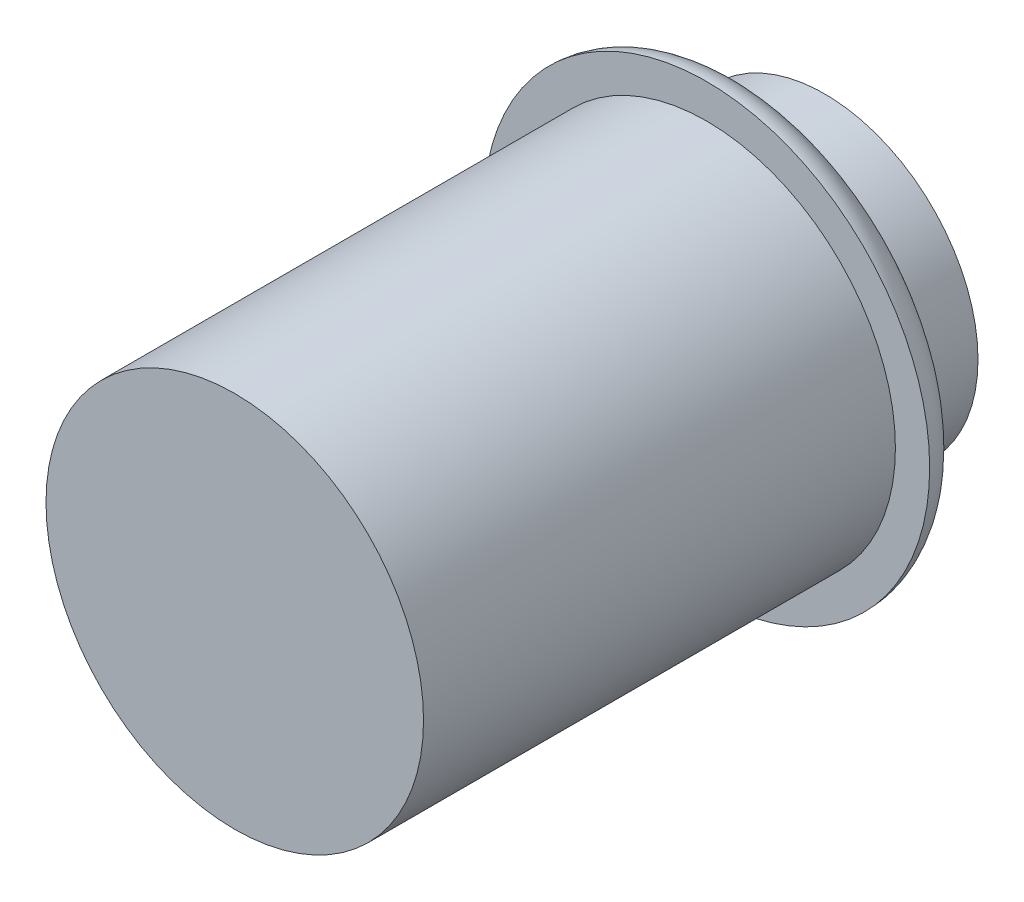
ISO-10303-21;
HEADER;
FILE_DESCRIPTION(('STEP AP214'),'2;1');
FILE_NAME('part.step','',(''),(''),'','','');
FILE_SCHEMA(('AUTOMOTIVE_DESIGN { 1 0 10303 214 1 1 1 1 }'));
ENDSEC;
DATA;
#1=APPLICATION_CONTEXT('core data for automotive mechanical design processes');
#2=APPLICATION_PROTOCOL_DEFINITION('international standard','automotive_design',2000,#1);
#3=PRODUCT_CONTEXT('',#1,'mechanical');
#4=PRODUCT('Part','Part','',(#3));
#5=PRODUCT_RELATED_PRODUCT_CATEGORY('part','',(#4));
#6=PRODUCT_DEFINITION_FORMATION('','',#4);
#7=PRODUCT_DEFINITION_CONTEXT('part definition',#1,'design');
#8=PRODUCT_DEFINITION('design','',#6,#7);
#9=PRODUCT_DEFINITION_SHAPE('','',#8);
#10=(LENGTH_UNIT() NAMED_UNIT(*) SI_UNIT(.MILLI.,.METRE.));
#11=(NAMED_UNIT(*) PLANE_ANGLE_UNIT() SI_UNIT($,.RADIAN.));
#12=(NAMED_UNIT(*) SI_UNIT($,.STERADIAN.) SOLID_ANGLE_UNIT());
#13=UNCERTAINTY_MEASURE_WITH_UNIT(LENGTH_MEASURE(1.E-05),#10,'distance_accuracy_value','');
#14=(GEOMETRIC_REPRESENTATION_CONTEXT(3) GLOBAL_UNCERTAINTY_ASSIGNED_CONTEXT((#13)) GLOBAL_UNIT_ASSIGNED_CONTEXT((#10,
#11,#12)) REPRESENTATION_CONTEXT('',''));
#15=CARTESIAN_POINT('',(0.,0.,0.));
#16=DIRECTION('',(0.,0.,1.));
#17=DIRECTION('',(1.,0.,0.));
#18=AXIS2_PLACEMENT_3D('',#15,#16,#17);
#19=CARTESIAN_POINT('',(0.,0.,20.));
#20=DIRECTION('',(0.,0.,-1.));
#21=DIRECTION('',(-1.,0.,0.));
#22=AXIS2_PLACEMENT_3D('',#19,#20,#21);
#23=CYLINDRICAL_SURFACE('',#22,8.);
#24=CARTESIAN_POINT('',(0.,0.,20.));
#25=DIRECTION('',(0.,0.,1.));
#26=DIRECTION('',(1.,0.,0.));
#27=AXIS2_PLACEMENT_3D('',#24,#25,#26);
#28=CIRCLE('',#27,8.);
#29=CARTESIAN_POINT('',(8.,0.,20.));
#30=VERTEX_POINT('',#29);
#31=EDGE_CURVE('E36',#30,#30,#28,.T.);
#32=ORIENTED_EDGE('',*,*,#31,.F.);
#33=EDGE_LOOP('',(#32));
#34=FACE_BOUND('',#33,.T.);
#35=CARTESIAN_POINT('',(0.,0.,0.));
#36=DIRECTION('',(0.,0.,1.));
#37=DIRECTION('',(1.,0.,0.));
#38=AXIS2_PLACEMENT_3D('',#35,#36,#37);
#39=CIRCLE('',#38,8.);
#40=CARTESIAN_POINT('',(8.,0.,0.));
#41=VERTEX_POINT('',#40);
#42=EDGE_CURVE('E40',#41,#41,#39,.T.);
#43=ORIENTED_EDGE('',*,*,#42,.T.);
#44=EDGE_LOOP('',(#43));
#45=FACE_BOUND('',#44,.T.);
#46=ADVANCED_FACE('F30',(#34,#45),#23,.T.);
#47=CARTESIAN_POINT('',(0.,0.,20.));
#48=DIRECTION('',(0.,0.,1.));
#49=DIRECTION('',(1.,0.,0.));
#50=AXIS2_PLACEMENT_3D('',#47,#48,#49);
#51=PLANE('',#50);
#52=ORIENTED_EDGE('',*,*,#31,.T.);
#53=EDGE_LOOP('',(#52));
#54=FACE_BOUND('',#53,.T.);
#55=ADVANCED_FACE('F71',(#54),#51,.T.);
#56=CARTESIAN_POINT('',(0.,0.,0.));
#57=DIRECTION('',(0.,0.,1.));
#58=DIRECTION('',(1.,0.,0.));
#59=AXIS2_PLACEMENT_3D('',#56,#57,#58);
#60=TOROIDAL_SURFACE('',#59,8.,1.45147886612915);
#61=CARTESIAN_POINT('',(0.,0.,0.));
#62=DIRECTION('',(0.,0.,1.));
#63=DIRECTION('',(1.,0.,0.));
#64=AXIS2_PLACEMENT_3D('',#61,#62,#63);
#65=CIRCLE('',#64,6.54852113387085);
#66=CARTESIAN_POINT('',(6.54852113387085,0.,0.));
#67=VERTEX_POINT('',#66);
#68=EDGE_CURVE('E49',#67,#67,#65,.T.);
#69=ORIENTED_EDGE('',*,*,#68,.T.);
#70=EDGE_LOOP('',(#69));
#71=FACE_BOUND('',#70,.T.);
#72=CARTESIAN_POINT('',(0.,0.,0.));
#73=DIRECTION('',(0.,0.,1.));
#74=DIRECTION('',(1.,0.,0.));
#75=AXIS2_PLACEMENT_3D('',#72,#73,#74);
#76=CIRCLE('',#75,9.45147886612915);
#77=CARTESIAN_POINT('',(9.45147886612915,0.,0.));
#78=VERTEX_POINT('',#77);
#79=EDGE_CURVE('E44',#78,#78,#76,.T.);
#80=ORIENTED_EDGE('',*,*,#79,.F.);
#81=EDGE_LOOP('',(#80));
#82=FACE_BOUND('',#81,.T.);
#83=ADVANCED_FACE('F76',(#71,#82),#60,.T.);
#84=CARTESIAN_POINT('',(9.45147886612915,0.,0.));
#85=DIRECTION('',(0.,0.,1.));
#86=DIRECTION('',(1.,0.,0.));
#87=AXIS2_PLACEMENT_3D('',#84,#85,#86);
#88=PLANE('',#87);
#89=ORIENTED_EDGE('',*,*,#42,.F.);
#90=EDGE_LOOP('',(#89));
#91=FACE_BOUND('',#90,.T.);
#92=ORIENTED_EDGE('',*,*,#79,.T.);
#93=EDGE_LOOP('',(#92));
#94=FACE_BOUND('',#93,.T.);
#95=ADVANCED_FACE('F67',(#91,#94),#88,.T.);
#96=CARTESIAN_POINT('',(0.,0.,0.));
#97=DIRECTION('',(0.,0.,1.));
#98=DIRECTION('',(1.,0.,0.));
#99=AXIS2_PLACEMENT_3D('',#96,#97,#98);
#100=PLANE('',#99);
#101=CARTESIAN_POINT('',(0.,0.,0.));
#102=DIRECTION('',(0.,0.,1.));
#103=DIRECTION('',(1.,0.,0.));
#104=AXIS2_PLACEMENT_3D('',#101,#102,#103);
#105=CIRCLE('',#104,6.5);
#106=CARTESIAN_POINT('',(6.5,0.,0.));
#107=VERTEX_POINT('',#106);
#108=EDGE_CURVE('E10',#107,#107,#105,.F.);
#109=ORIENTED_EDGE('',*,*,#108,.F.);
#110=EDGE_LOOP('',(#109));
#111=FACE_BOUND('',#110,.T.);
#112=ORIENTED_EDGE('',*,*,#68,.F.);
#113=EDGE_LOOP('',(#112));
#114=FACE_BOUND('',#113,.T.);
#115=ADVANCED_FACE('F60',(#111,#114),#100,.F.);
#116=CARTESIAN_POINT('',(0.,0.,-5.));
#117=DIRECTION('',(0.,0.,1.));
#118=DIRECTION('',(1.,0.,0.));
#119=AXIS2_PLACEMENT_3D('',#116,#117,#118);
#120=CYLINDRICAL_SURFACE('',#119,6.5);
#121=CARTESIAN_POINT('',(0.,0.,-5.));
#122=DIRECTION('',(0.,0.,-1.));
#123=DIRECTION('',(-1.,0.,0.));
#124=AXIS2_PLACEMENT_3D('',#121,#122,#123);
#125=CIRCLE('',#124,6.5);
#126=CARTESIAN_POINT('',(-6.5,0.,-5.));
#127=VERTEX_POINT('',#126);
#128=EDGE_CURVE('E52',#127,#127,#125,.T.);
#129=ORIENTED_EDGE('',*,*,#128,.F.);
#130=EDGE_LOOP('',(#129));
#131=FACE_BOUND('',#130,.T.);
#132=ORIENTED_EDGE('',*,*,#108,.T.);
#133=EDGE_LOOP('',(#132));
#134=FACE_BOUND('',#133,.T.);
#135=ADVANCED_FACE('F58',(#131,#134),#120,.T.);
#136=CARTESIAN_POINT('',(0.,0.,-5.));
#137=DIRECTION('',(0.,0.,-1.));
#138=DIRECTION('',(-1.,0.,0.));
#139=AXIS2_PLACEMENT_3D('',#136,#137,#138);
#140=PLANE('',#139);
#141=ORIENTED_EDGE('',*,*,#128,.T.);
#142=EDGE_LOOP('',(#141));
#143=FACE_BOUND('',#142,.T.);
#144=ADVANCED_FACE('F56',(#143),#140,.T.);
#145=CLOSED_SHELL('',(#46,#55,#83,#95,#115,#135,#144));
#146=MANIFOLD_SOLID_BREP('B2',#145);
#147=ADVANCED_BREP_SHAPE_REPRESENTATION('',(#18,#146),#14);
#148=SHAPE_DEFINITION_REPRESENTATION(#9,#147);
ENDSEC;
END-ISO-10303-21;
